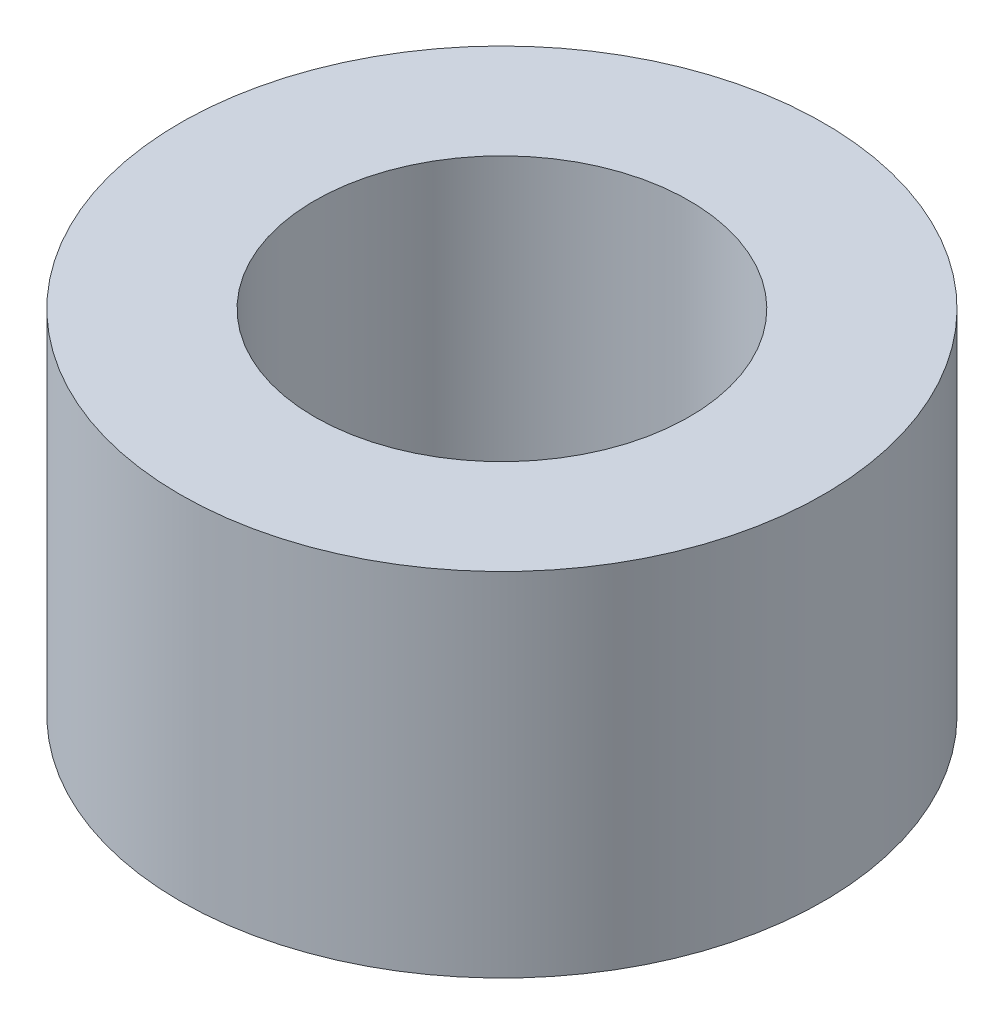
ISO-10303-21;
HEADER;
FILE_DESCRIPTION(('STEP AP214'),'2;1');
FILE_NAME('part.step','',(''),(''),'','','');
FILE_SCHEMA(('AUTOMOTIVE_DESIGN { 1 0 10303 214 1 1 1 1 }'));
ENDSEC;
DATA;
#1=APPLICATION_CONTEXT('core data for automotive mechanical design processes');
#2=APPLICATION_PROTOCOL_DEFINITION('international standard','automotive_design',2000,#1);
#3=PRODUCT_CONTEXT('',#1,'mechanical');
#4=PRODUCT('Part','Part','',(#3));
#5=PRODUCT_RELATED_PRODUCT_CATEGORY('part','',(#4));
#6=PRODUCT_DEFINITION_FORMATION('','',#4);
#7=PRODUCT_DEFINITION_CONTEXT('part definition',#1,'design');
#8=PRODUCT_DEFINITION('design','',#6,#7);
#9=PRODUCT_DEFINITION_SHAPE('','',#8);
#10=(LENGTH_UNIT() NAMED_UNIT(*) SI_UNIT(.MILLI.,.METRE.));
#11=(NAMED_UNIT(*) PLANE_ANGLE_UNIT() SI_UNIT($,.RADIAN.));
#12=(NAMED_UNIT(*) SI_UNIT($,.STERADIAN.) SOLID_ANGLE_UNIT());
#13=UNCERTAINTY_MEASURE_WITH_UNIT(LENGTH_MEASURE(1.E-05),#10,'distance_accuracy_value','');
#14=(GEOMETRIC_REPRESENTATION_CONTEXT(3) GLOBAL_UNCERTAINTY_ASSIGNED_CONTEXT((#13)) GLOBAL_UNIT_ASSIGNED_CONTEXT((#10,
#11,#12)) REPRESENTATION_CONTEXT('',''));
#15=CARTESIAN_POINT('',(0.,0.,0.));
#16=DIRECTION('',(0.,0.,1.));
#17=DIRECTION('',(1.,0.,0.));
#18=AXIS2_PLACEMENT_3D('',#15,#16,#17);
#19=CARTESIAN_POINT('',(0.,6.35,0.));
#20=DIRECTION('',(0.,-1.,0.));
#21=DIRECTION('',(0.,0.,-1.));
#22=AXIS2_PLACEMENT_3D('',#19,#20,#21);
#23=CYLINDRICAL_SURFACE('',#22,5.8039);
#24=CARTESIAN_POINT('',(0.,6.35,0.));
#25=DIRECTION('',(0.,1.,0.));
#26=DIRECTION('',(0.,0.,1.));
#27=AXIS2_PLACEMENT_3D('',#24,#25,#26);
#28=CIRCLE('',#27,5.8039);
#29=CARTESIAN_POINT('',(0.,6.35,5.8039));
#30=VERTEX_POINT('',#29);
#31=EDGE_CURVE('E10',#30,#30,#28,.T.);
#32=ORIENTED_EDGE('',*,*,#31,.F.);
#33=EDGE_LOOP('',(#32));
#34=FACE_BOUND('',#33,.T.);
#35=CARTESIAN_POINT('',(0.,0.,0.));
#36=DIRECTION('',(0.,1.,0.));
#37=DIRECTION('',(0.,0.,1.));
#38=AXIS2_PLACEMENT_3D('',#35,#36,#37);
#39=CIRCLE('',#38,5.8039);
#40=CARTESIAN_POINT('',(0.,0.,5.8039));
#41=VERTEX_POINT('',#40);
#42=EDGE_CURVE('E44',#41,#41,#39,.T.);
#43=ORIENTED_EDGE('',*,*,#42,.T.);
#44=EDGE_LOOP('',(#43));
#45=FACE_BOUND('',#44,.T.);
#46=ADVANCED_FACE('F41',(#34,#45),#23,.T.);
#47=CARTESIAN_POINT('',(0.,6.35,0.));
#48=DIRECTION('',(0.,1.,0.));
#49=DIRECTION('',(0.,0.,1.));
#50=AXIS2_PLACEMENT_3D('',#47,#48,#49);
#51=PLANE('',#50);
#52=CARTESIAN_POINT('',(0.,6.35,0.));
#53=DIRECTION('',(0.,1.,0.));
#54=DIRECTION('',(0.,0.,1.));
#55=AXIS2_PLACEMENT_3D('',#52,#53,#54);
#56=CIRCLE('',#55,3.3782);
#57=CARTESIAN_POINT('',(0.,6.35,3.3782));
#58=VERTEX_POINT('',#57);
#59=EDGE_CURVE('E58',#58,#58,#56,.T.);
#60=ORIENTED_EDGE('',*,*,#59,.F.);
#61=EDGE_LOOP('',(#60));
#62=FACE_BOUND('',#61,.T.);
#63=ORIENTED_EDGE('',*,*,#31,.T.);
#64=EDGE_LOOP('',(#63));
#65=FACE_BOUND('',#64,.T.);
#66=ADVANCED_FACE('F65',(#62,#65),#51,.T.);
#67=CARTESIAN_POINT('',(0.,0.,0.));
#68=DIRECTION('',(0.,1.,0.));
#69=DIRECTION('',(0.,0.,1.));
#70=AXIS2_PLACEMENT_3D('',#67,#68,#69);
#71=PLANE('',#70);
#72=CARTESIAN_POINT('',(0.,0.,0.));
#73=DIRECTION('',(0.,1.,0.));
#74=DIRECTION('',(0.,0.,1.));
#75=AXIS2_PLACEMENT_3D('',#72,#73,#74);
#76=CIRCLE('',#75,3.3782);
#77=CARTESIAN_POINT('',(0.,0.,3.3782));
#78=VERTEX_POINT('',#77);
#79=EDGE_CURVE('E53',#78,#78,#76,.T.);
#80=ORIENTED_EDGE('',*,*,#79,.T.);
#81=EDGE_LOOP('',(#80));
#82=FACE_BOUND('',#81,.T.);
#83=ORIENTED_EDGE('',*,*,#42,.F.);
#84=EDGE_LOOP('',(#83));
#85=FACE_BOUND('',#84,.T.);
#86=ADVANCED_FACE('F67',(#82,#85),#71,.F.);
#87=CARTESIAN_POINT('',(0.,6.35,0.));
#88=DIRECTION('',(0.,1.,0.));
#89=DIRECTION('',(0.,0.,1.));
#90=AXIS2_PLACEMENT_3D('',#87,#88,#89);
#91=CYLINDRICAL_SURFACE('',#90,3.3782);
#92=ORIENTED_EDGE('',*,*,#79,.F.);
#93=EDGE_LOOP('',(#92));
#94=FACE_BOUND('',#93,.T.);
#95=ORIENTED_EDGE('',*,*,#59,.T.);
#96=EDGE_LOOP('',(#95));
#97=FACE_BOUND('',#96,.T.);
#98=ADVANCED_FACE('F63',(#94,#97),#91,.F.);
#99=CLOSED_SHELL('',(#46,#66,#86,#98));
#100=MANIFOLD_SOLID_BREP('B2',#99);
#101=ADVANCED_BREP_SHAPE_REPRESENTATION('',(#18,#100),#14);
#102=SHAPE_DEFINITION_REPRESENTATION(#9,#101);
ENDSEC;
END-ISO-10303-21;
